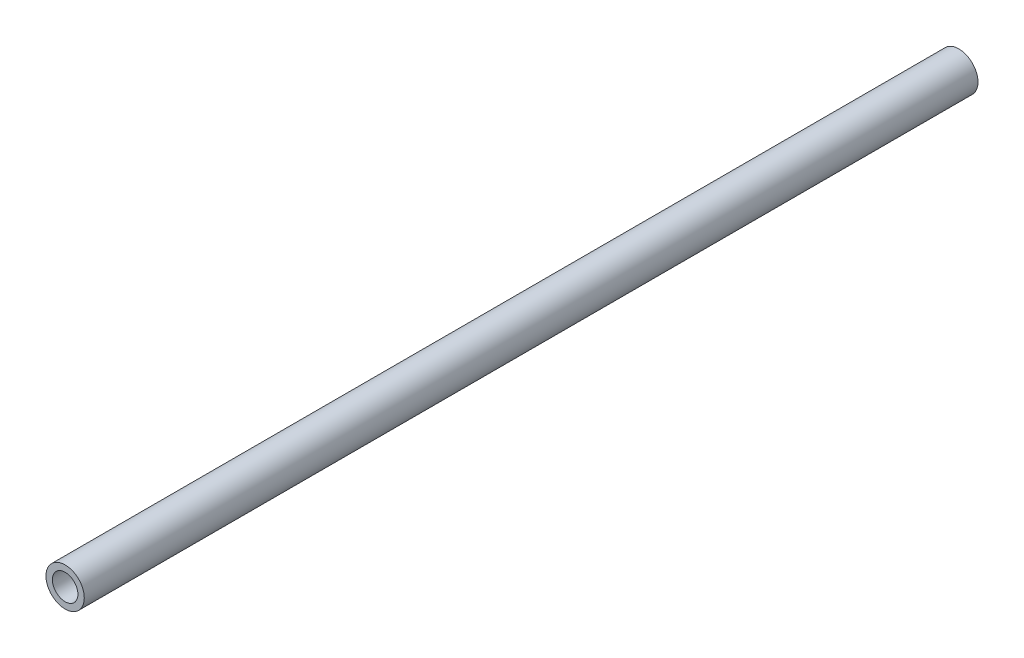
ISO-10303-21;
HEADER;
FILE_DESCRIPTION(('STEP AP214'),'2;1');
FILE_NAME('part.step','',(''),(''),'','','');
FILE_SCHEMA(('AUTOMOTIVE_DESIGN { 1 0 10303 214 1 1 1 1 }'));
ENDSEC;
DATA;
#1=APPLICATION_CONTEXT('core data for automotive mechanical design processes');
#2=APPLICATION_PROTOCOL_DEFINITION('international standard','automotive_design',2000,#1);
#3=PRODUCT_CONTEXT('',#1,'mechanical');
#4=PRODUCT('Part','Part','',(#3));
#5=PRODUCT_RELATED_PRODUCT_CATEGORY('part','',(#4));
#6=PRODUCT_DEFINITION_FORMATION('','',#4);
#7=PRODUCT_DEFINITION_CONTEXT('part definition',#1,'design');
#8=PRODUCT_DEFINITION('design','',#6,#7);
#9=PRODUCT_DEFINITION_SHAPE('','',#8);
#10=(LENGTH_UNIT() NAMED_UNIT(*) SI_UNIT(.MILLI.,.METRE.));
#11=(NAMED_UNIT(*) PLANE_ANGLE_UNIT() SI_UNIT($,.RADIAN.));
#12=(NAMED_UNIT(*) SI_UNIT($,.STERADIAN.) SOLID_ANGLE_UNIT());
#13=UNCERTAINTY_MEASURE_WITH_UNIT(LENGTH_MEASURE(1.E-05),#10,'distance_accuracy_value','');
#14=(GEOMETRIC_REPRESENTATION_CONTEXT(3) GLOBAL_UNCERTAINTY_ASSIGNED_CONTEXT((#13)) GLOBAL_UNIT_ASSIGNED_CONTEXT((#10,
#11,#12)) REPRESENTATION_CONTEXT('',''));
#15=CARTESIAN_POINT('',(0.,0.,0.));
#16=DIRECTION('',(0.,0.,1.));
#17=DIRECTION('',(1.,0.,0.));
#18=AXIS2_PLACEMENT_3D('',#15,#16,#17);
#19=CARTESIAN_POINT('',(0.,0.,700.));
#20=DIRECTION('',(0.,0.,1.));
#21=DIRECTION('',(1.,0.,0.));
#22=AXIS2_PLACEMENT_3D('',#19,#20,#21);
#23=PLANE('',#22);
#24=CARTESIAN_POINT('',(0.,0.,700.));
#25=DIRECTION('',(0.,0.,1.));
#26=DIRECTION('',(1.,0.,0.));
#27=AXIS2_PLACEMENT_3D('',#24,#25,#26);
#28=CIRCLE('',#27,15.);
#29=CARTESIAN_POINT('',(15.,0.,700.));
#30=VERTEX_POINT('',#29);
#31=EDGE_CURVE('E10',#30,#30,#28,.T.);
#32=ORIENTED_EDGE('',*,*,#31,.T.);
#33=EDGE_LOOP('',(#32));
#34=FACE_BOUND('',#33,.T.);
#35=CARTESIAN_POINT('',(0.,0.,700.));
#36=DIRECTION('',(0.,0.,1.));
#37=DIRECTION('',(1.,0.,0.));
#38=AXIS2_PLACEMENT_3D('',#35,#36,#37);
#39=CIRCLE('',#38,10.);
#40=CARTESIAN_POINT('',(10.,0.,700.));
#41=VERTEX_POINT('',#40);
#42=EDGE_CURVE('E46',#41,#41,#39,.T.);
#43=ORIENTED_EDGE('',*,*,#42,.F.);
#44=EDGE_LOOP('',(#43));
#45=FACE_BOUND('',#44,.T.);
#46=ADVANCED_FACE('F35',(#34,#45),#23,.T.);
#47=CARTESIAN_POINT('',(0.,0.,0.));
#48=DIRECTION('',(0.,0.,1.));
#49=DIRECTION('',(1.,0.,0.));
#50=AXIS2_PLACEMENT_3D('',#47,#48,#49);
#51=PLANE('',#50);
#52=CARTESIAN_POINT('',(0.,0.,0.));
#53=DIRECTION('',(0.,0.,1.));
#54=DIRECTION('',(1.,0.,0.));
#55=AXIS2_PLACEMENT_3D('',#52,#53,#54);
#56=CIRCLE('',#55,15.);
#57=CARTESIAN_POINT('',(15.,0.,0.));
#58=VERTEX_POINT('',#57);
#59=EDGE_CURVE('E39',#58,#58,#56,.T.);
#60=ORIENTED_EDGE('',*,*,#59,.F.);
#61=EDGE_LOOP('',(#60));
#62=FACE_BOUND('',#61,.T.);
#63=CARTESIAN_POINT('',(0.,0.,0.));
#64=DIRECTION('',(0.,0.,1.));
#65=DIRECTION('',(1.,0.,0.));
#66=AXIS2_PLACEMENT_3D('',#63,#64,#65);
#67=CIRCLE('',#66,10.);
#68=CARTESIAN_POINT('',(10.,0.,0.));
#69=VERTEX_POINT('',#68);
#70=EDGE_CURVE('E48',#69,#69,#67,.T.);
#71=ORIENTED_EDGE('',*,*,#70,.T.);
#72=EDGE_LOOP('',(#71));
#73=FACE_BOUND('',#72,.T.);
#74=ADVANCED_FACE('F58',(#62,#73),#51,.F.);
#75=CARTESIAN_POINT('',(0.,0.,700.));
#76=DIRECTION('',(0.,0.,-1.));
#77=DIRECTION('',(-1.,0.,0.));
#78=AXIS2_PLACEMENT_3D('',#75,#76,#77);
#79=CYLINDRICAL_SURFACE('',#78,15.);
#80=ORIENTED_EDGE('',*,*,#31,.F.);
#81=EDGE_LOOP('',(#80));
#82=FACE_BOUND('',#81,.T.);
#83=ORIENTED_EDGE('',*,*,#59,.T.);
#84=EDGE_LOOP('',(#83));
#85=FACE_BOUND('',#84,.T.);
#86=ADVANCED_FACE('F37',(#82,#85),#79,.T.);
#87=CARTESIAN_POINT('',(0.,0.,700.));
#88=DIRECTION('',(0.,0.,-1.));
#89=DIRECTION('',(-1.,0.,0.));
#90=AXIS2_PLACEMENT_3D('',#87,#88,#89);
#91=CYLINDRICAL_SURFACE('',#90,10.);
#92=ORIENTED_EDGE('',*,*,#42,.T.);
#93=EDGE_LOOP('',(#92));
#94=FACE_BOUND('',#93,.T.);
#95=ORIENTED_EDGE('',*,*,#70,.F.);
#96=EDGE_LOOP('',(#95));
#97=FACE_BOUND('',#96,.T.);
#98=ADVANCED_FACE('F54',(#94,#97),#91,.F.);
#99=CLOSED_SHELL('',(#46,#74,#86,#98));
#100=MANIFOLD_SOLID_BREP('B2',#99);
#101=ADVANCED_BREP_SHAPE_REPRESENTATION('',(#18,#100),#14);
#102=SHAPE_DEFINITION_REPRESENTATION(#9,#101);
ENDSEC;
END-ISO-10303-21;
